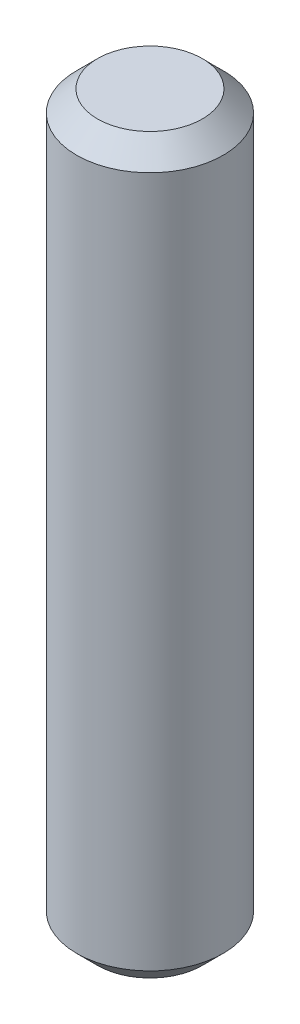
ISO-10303-21;
HEADER;
FILE_DESCRIPTION(('STEP AP214'),'2;1');
FILE_NAME('part.step','',(''),(''),'','','');
FILE_SCHEMA(('AUTOMOTIVE_DESIGN { 1 0 10303 214 1 1 1 1 }'));
ENDSEC;
DATA;
#1=APPLICATION_CONTEXT('core data for automotive mechanical design processes');
#2=APPLICATION_PROTOCOL_DEFINITION('international standard','automotive_design',2000,#1);
#3=PRODUCT_CONTEXT('',#1,'mechanical');
#4=PRODUCT('Part','Part','',(#3));
#5=PRODUCT_RELATED_PRODUCT_CATEGORY('part','',(#4));
#6=PRODUCT_DEFINITION_FORMATION('','',#4);
#7=PRODUCT_DEFINITION_CONTEXT('part definition',#1,'design');
#8=PRODUCT_DEFINITION('design','',#6,#7);
#9=PRODUCT_DEFINITION_SHAPE('','',#8);
#10=(LENGTH_UNIT() NAMED_UNIT(*) SI_UNIT(.MILLI.,.METRE.));
#11=(NAMED_UNIT(*) PLANE_ANGLE_UNIT() SI_UNIT($,.RADIAN.));
#12=(NAMED_UNIT(*) SI_UNIT($,.STERADIAN.) SOLID_ANGLE_UNIT());
#13=UNCERTAINTY_MEASURE_WITH_UNIT(LENGTH_MEASURE(1.E-05),#10,'distance_accuracy_value','');
#14=(GEOMETRIC_REPRESENTATION_CONTEXT(3) GLOBAL_UNCERTAINTY_ASSIGNED_CONTEXT((#13)) GLOBAL_UNIT_ASSIGNED_CONTEXT((#10,
#11,#12)) REPRESENTATION_CONTEXT('',''));
#15=CARTESIAN_POINT('',(0.,0.,0.));
#16=DIRECTION('',(0.,0.,1.));
#17=DIRECTION('',(1.,0.,0.));
#18=AXIS2_PLACEMENT_3D('',#15,#16,#17);
#19=CARTESIAN_POINT('',(0.,35.,0.));
#20=DIRECTION('',(0.,-1.,0.));
#21=DIRECTION('',(0.,0.,-1.));
#22=AXIS2_PLACEMENT_3D('',#19,#20,#21);
#23=CYLINDRICAL_SURFACE('',#22,7.);
#24=CARTESIAN_POINT('',(0.,-33.,0.));
#25=DIRECTION('',(0.,1.,0.));
#26=DIRECTION('',(0.,0.,1.));
#27=AXIS2_PLACEMENT_3D('',#24,#25,#26);
#28=CIRCLE('',#27,7.);
#29=CARTESIAN_POINT('',(0.,-33.,7.));
#30=VERTEX_POINT('',#29);
#31=EDGE_CURVE('E53',#30,#30,#28,.T.);
#32=ORIENTED_EDGE('',*,*,#31,.T.);
#33=EDGE_LOOP('',(#32));
#34=FACE_BOUND('',#33,.T.);
#35=CARTESIAN_POINT('',(0.,33.,0.));
#36=DIRECTION('',(0.,1.,0.));
#37=DIRECTION('',(0.,0.,1.));
#38=AXIS2_PLACEMENT_3D('',#35,#36,#37);
#39=CIRCLE('',#38,7.);
#40=CARTESIAN_POINT('',(0.,33.,7.));
#41=VERTEX_POINT('',#40);
#42=EDGE_CURVE('E57',#41,#41,#39,.F.);
#43=ORIENTED_EDGE('',*,*,#42,.T.);
#44=EDGE_LOOP('',(#43));
#45=FACE_BOUND('',#44,.T.);
#46=ADVANCED_FACE('F41',(#34,#45),#23,.T.);
#47=CARTESIAN_POINT('',(0.,35.,0.));
#48=DIRECTION('',(0.,1.,0.));
#49=DIRECTION('',(0.,0.,1.));
#50=AXIS2_PLACEMENT_3D('',#47,#48,#49);
#51=PLANE('',#50);
#52=CARTESIAN_POINT('',(0.,35.,0.));
#53=DIRECTION('',(0.,1.,0.));
#54=DIRECTION('',(0.,0.,1.));
#55=AXIS2_PLACEMENT_3D('',#52,#53,#54);
#56=CIRCLE('',#55,4.99999999999998);
#57=CARTESIAN_POINT('',(0.,35.,4.99999999999998));
#58=VERTEX_POINT('',#57);
#59=EDGE_CURVE('E10',#58,#58,#56,.T.);
#60=ORIENTED_EDGE('',*,*,#59,.T.);
#61=EDGE_LOOP('',(#60));
#62=FACE_BOUND('',#61,.T.);
#63=ADVANCED_FACE('F73',(#62),#51,.T.);
#64=CARTESIAN_POINT('',(0.,-35.,0.));
#65=DIRECTION('',(0.,1.,0.));
#66=DIRECTION('',(0.,0.,1.));
#67=AXIS2_PLACEMENT_3D('',#64,#65,#66);
#68=PLANE('',#67);
#69=CARTESIAN_POINT('',(0.,-35.,0.));
#70=DIRECTION('',(0.,1.,0.));
#71=DIRECTION('',(0.,0.,1.));
#72=AXIS2_PLACEMENT_3D('',#69,#70,#71);
#73=CIRCLE('',#72,4.99999999999999);
#74=CARTESIAN_POINT('',(0.,-35.,4.99999999999999));
#75=VERTEX_POINT('',#74);
#76=EDGE_CURVE('E49',#75,#75,#73,.F.);
#77=ORIENTED_EDGE('',*,*,#76,.T.);
#78=EDGE_LOOP('',(#77));
#79=FACE_BOUND('',#78,.T.);
#80=ADVANCED_FACE('F70',(#79),#68,.F.);
#81=CARTESIAN_POINT('',(0.,-33.,0.));
#82=DIRECTION('',(0.,1.,0.));
#83=DIRECTION('',(0.,0.,1.));
#84=AXIS2_PLACEMENT_3D('',#81,#82,#83);
#85=CONICAL_SURFACE('',#84,7.,0.78539816339745);
#86=ORIENTED_EDGE('',*,*,#76,.F.);
#87=EDGE_LOOP('',(#86));
#88=FACE_BOUND('',#87,.T.);
#89=ORIENTED_EDGE('',*,*,#31,.F.);
#90=EDGE_LOOP('',(#89));
#91=FACE_BOUND('',#90,.T.);
#92=ADVANCED_FACE('F66',(#88,#91),#85,.T.);
#93=CARTESIAN_POINT('',(0.,35.,0.));
#94=DIRECTION('',(0.,-1.,0.));
#95=DIRECTION('',(0.,0.,-1.));
#96=AXIS2_PLACEMENT_3D('',#93,#94,#95);
#97=CONICAL_SURFACE('',#96,4.99999999999998,0.785398163397445);
#98=ORIENTED_EDGE('',*,*,#42,.F.);
#99=EDGE_LOOP('',(#98));
#100=FACE_BOUND('',#99,.T.);
#101=ORIENTED_EDGE('',*,*,#59,.F.);
#102=EDGE_LOOP('',(#101));
#103=FACE_BOUND('',#102,.T.);
#104=ADVANCED_FACE('F44',(#100,#103),#97,.T.);
#105=CLOSED_SHELL('',(#46,#63,#80,#92,#104));
#106=MANIFOLD_SOLID_BREP('B2',#105);
#107=ADVANCED_BREP_SHAPE_REPRESENTATION('',(#18,#106),#14);
#108=SHAPE_DEFINITION_REPRESENTATION(#9,#107);
ENDSEC;
END-ISO-10303-21;
